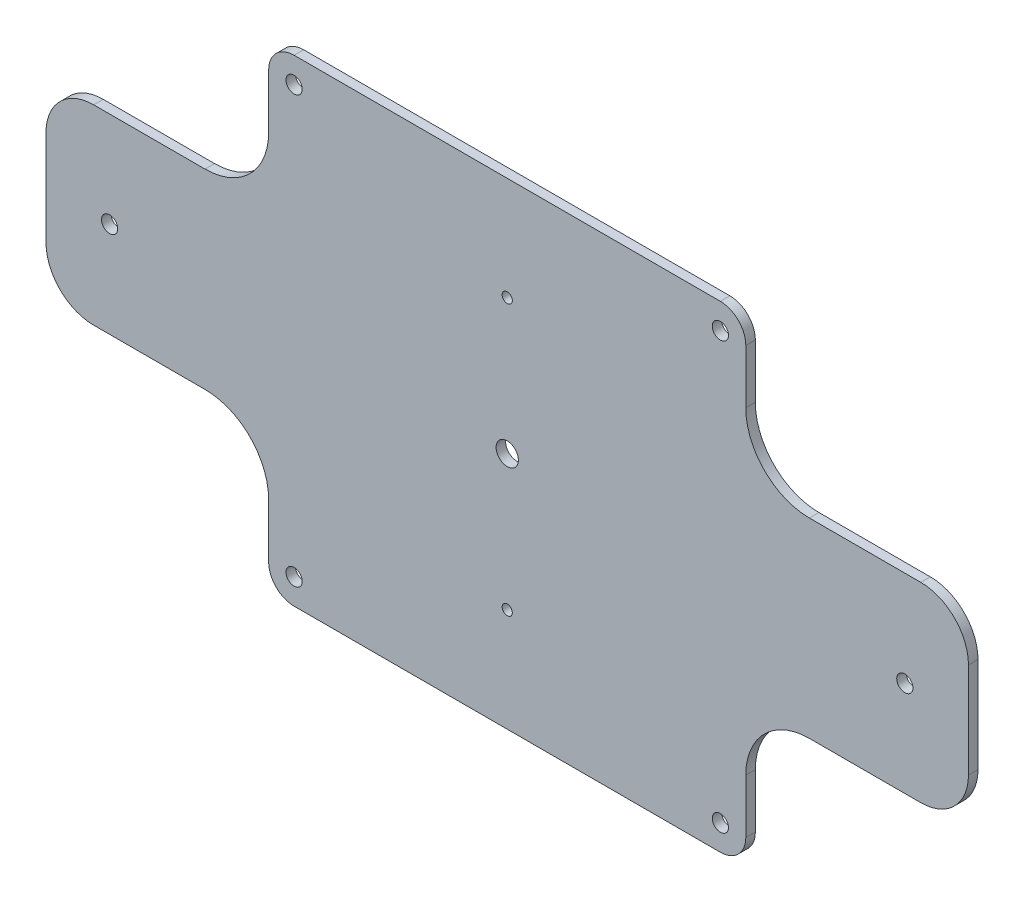
ISO-10303-21;
HEADER;
FILE_DESCRIPTION(('STEP AP214'),'2;1');
FILE_NAME('part.step','',(''),(''),'','','');
FILE_SCHEMA(('AUTOMOTIVE_DESIGN { 1 0 10303 214 1 1 1 1 }'));
ENDSEC;
DATA;
#1=APPLICATION_CONTEXT('core data for automotive mechanical design processes');
#2=APPLICATION_PROTOCOL_DEFINITION('international standard','automotive_design',2000,#1);
#3=PRODUCT_CONTEXT('',#1,'mechanical');
#4=PRODUCT('Part','Part','',(#3));
#5=PRODUCT_RELATED_PRODUCT_CATEGORY('part','',(#4));
#6=PRODUCT_DEFINITION_FORMATION('','',#4);
#7=PRODUCT_DEFINITION_CONTEXT('part definition',#1,'design');
#8=PRODUCT_DEFINITION('design','',#6,#7);
#9=PRODUCT_DEFINITION_SHAPE('','',#8);
#10=(LENGTH_UNIT() NAMED_UNIT(*) SI_UNIT(.MILLI.,.METRE.));
#11=(NAMED_UNIT(*) PLANE_ANGLE_UNIT() SI_UNIT($,.RADIAN.));
#12=(NAMED_UNIT(*) SI_UNIT($,.STERADIAN.) SOLID_ANGLE_UNIT());
#13=UNCERTAINTY_MEASURE_WITH_UNIT(LENGTH_MEASURE(1.E-05),#10,'distance_accuracy_value','');
#14=(GEOMETRIC_REPRESENTATION_CONTEXT(3) GLOBAL_UNCERTAINTY_ASSIGNED_CONTEXT((#13)) GLOBAL_UNIT_ASSIGNED_CONTEXT((#10,
#11,#12)) REPRESENTATION_CONTEXT('',''));
#15=CARTESIAN_POINT('',(0.,0.,0.));
#16=DIRECTION('',(0.,0.,1.));
#17=DIRECTION('',(1.,0.,0.));
#18=AXIS2_PLACEMENT_3D('',#15,#16,#17);
#19=CARTESIAN_POINT('',(75.,75.,3.));
#20=DIRECTION('',(-1.,0.,0.));
#21=DIRECTION('',(0.,0.,1.));
#22=AXIS2_PLACEMENT_3D('',#19,#20,#21);
#23=PLANE('',#22);
#24=DIRECTION('',(0.,1.,0.));
#25=VECTOR('',#24,1.);
#26=CARTESIAN_POINT('',(75.,75.,3.));
#27=LINE('',#26,#25);
#28=CARTESIAN_POINT('',(75.,50.,3.));
#29=VERTEX_POINT('',#28);
#30=CARTESIAN_POINT('',(75.,67.,3.));
#31=VERTEX_POINT('',#30);
#32=EDGE_CURVE('E228',#29,#31,#27,.T.);
#33=ORIENTED_EDGE('',*,*,#32,.F.);
#34=DIRECTION('',(0.,0.,1.));
#35=VECTOR('',#34,1.);
#36=CARTESIAN_POINT('',(75.,50.,0.));
#37=LINE('',#36,#35);
#38=CARTESIAN_POINT('',(75.,50.,0.));
#39=VERTEX_POINT('',#38);
#40=EDGE_CURVE('E286',#29,#39,#37,.F.);
#41=ORIENTED_EDGE('',*,*,#40,.T.);
#42=DIRECTION('',(0.,1.,0.));
#43=VECTOR('',#42,1.);
#44=CARTESIAN_POINT('',(75.,75.,0.));
#45=LINE('',#44,#43);
#46=CARTESIAN_POINT('',(75.,67.,0.));
#47=VERTEX_POINT('',#46);
#48=EDGE_CURVE('E254',#39,#47,#45,.T.);
#49=ORIENTED_EDGE('',*,*,#48,.T.);
#50=DIRECTION('',(0.,0.,-1.));
#51=VECTOR('',#50,1.);
#52=CARTESIAN_POINT('',(75.,67.,3.));
#53=LINE('',#52,#51);
#54=EDGE_CURVE('E272',#47,#31,#53,.F.);
#55=ORIENTED_EDGE('',*,*,#54,.T.);
#56=EDGE_LOOP('',(#33,#41,#49,#55));
#57=FACE_BOUND('',#56,.T.);
#58=ADVANCED_FACE('F35',(#57),#23,.F.);
#59=CARTESIAN_POINT('',(75.,-67.,0.));
#60=VERTEX_POINT('',#59);
#61=CARTESIAN_POINT('',(75.,-50.,0.));
#62=VERTEX_POINT('',#61);
#63=EDGE_CURVE('E430',#60,#62,#45,.T.);
#64=ORIENTED_EDGE('',*,*,#63,.T.);
#65=DIRECTION('',(0.,0.,1.));
#66=VECTOR('',#65,1.);
#67=CARTESIAN_POINT('',(75.,-50.,3.));
#68=LINE('',#67,#66);
#69=CARTESIAN_POINT('',(75.,-50.,3.));
#70=VERTEX_POINT('',#69);
#71=EDGE_CURVE('E288',#62,#70,#68,.T.);
#72=ORIENTED_EDGE('',*,*,#71,.T.);
#73=CARTESIAN_POINT('',(75.,-67.,3.));
#74=VERTEX_POINT('',#73);
#75=EDGE_CURVE('E231',#74,#70,#27,.T.);
#76=ORIENTED_EDGE('',*,*,#75,.F.);
#77=DIRECTION('',(0.,0.,-1.));
#78=VECTOR('',#77,1.);
#79=CARTESIAN_POINT('',(75.,-67.,3.));
#80=LINE('',#79,#78);
#81=EDGE_CURVE('E275',#74,#60,#80,.T.);
#82=ORIENTED_EDGE('',*,*,#81,.T.);
#83=EDGE_LOOP('',(#64,#72,#76,#82));
#84=FACE_BOUND('',#83,.T.);
#85=ADVANCED_FACE('F518',(#84),#23,.F.);
#86=CARTESIAN_POINT('',(-75.,75.,3.));
#87=DIRECTION('',(1.,0.,0.));
#88=DIRECTION('',(0.,0.,-1.));
#89=AXIS2_PLACEMENT_3D('',#86,#87,#88);
#90=PLANE('',#89);
#91=DIRECTION('',(0.,-1.,0.));
#92=VECTOR('',#91,1.);
#93=CARTESIAN_POINT('',(-75.,75.,0.));
#94=LINE('',#93,#92);
#95=CARTESIAN_POINT('',(-75.,67.,0.));
#96=VERTEX_POINT('',#95);
#97=CARTESIAN_POINT('',(-75.,50.,0.));
#98=VERTEX_POINT('',#97);
#99=EDGE_CURVE('E229',#96,#98,#94,.T.);
#100=ORIENTED_EDGE('',*,*,#99,.T.);
#101=DIRECTION('',(0.,0.,1.));
#102=VECTOR('',#101,1.);
#103=CARTESIAN_POINT('',(-75.,50.,3.));
#104=LINE('',#103,#102);
#105=CARTESIAN_POINT('',(-75.,50.,3.));
#106=VERTEX_POINT('',#105);
#107=EDGE_CURVE('E298',#98,#106,#104,.T.);
#108=ORIENTED_EDGE('',*,*,#107,.T.);
#109=DIRECTION('',(0.,-1.,0.));
#110=VECTOR('',#109,1.);
#111=CARTESIAN_POINT('',(-75.,75.,3.));
#112=LINE('',#111,#110);
#113=CARTESIAN_POINT('',(-75.,67.,3.));
#114=VERTEX_POINT('',#113);
#115=EDGE_CURVE('E426',#114,#106,#112,.T.);
#116=ORIENTED_EDGE('',*,*,#115,.F.);
#117=DIRECTION('',(0.,0.,-1.));
#118=VECTOR('',#117,1.);
#119=CARTESIAN_POINT('',(-75.,67.,3.));
#120=LINE('',#119,#118);
#121=EDGE_CURVE('E210',#114,#96,#120,.T.);
#122=ORIENTED_EDGE('',*,*,#121,.T.);
#123=EDGE_LOOP('',(#100,#108,#116,#122));
#124=FACE_BOUND('',#123,.T.);
#125=ADVANCED_FACE('F475',(#124),#90,.F.);
#126=CARTESIAN_POINT('',(-75.,75.,3.));
#127=DIRECTION('',(0.,-1.,0.));
#128=DIRECTION('',(0.,0.,-1.));
#129=AXIS2_PLACEMENT_3D('',#126,#127,#128);
#130=PLANE('',#129);
#131=DIRECTION('',(-1.,0.,0.));
#132=VECTOR('',#131,1.);
#133=CARTESIAN_POINT('',(-75.,75.,3.));
#134=LINE('',#133,#132);
#135=CARTESIAN_POINT('',(67.,75.,3.));
#136=VERTEX_POINT('',#135);
#137=CARTESIAN_POINT('',(-67.,75.,3.));
#138=VERTEX_POINT('',#137);
#139=EDGE_CURVE('E422',#136,#138,#134,.T.);
#140=ORIENTED_EDGE('',*,*,#139,.F.);
#141=DIRECTION('',(0.,0.,-1.));
#142=VECTOR('',#141,1.);
#143=CARTESIAN_POINT('',(67.,75.,3.));
#144=LINE('',#143,#142);
#145=CARTESIAN_POINT('',(67.,75.,0.));
#146=VERTEX_POINT('',#145);
#147=EDGE_CURVE('E280',#136,#146,#144,.T.);
#148=ORIENTED_EDGE('',*,*,#147,.T.);
#149=DIRECTION('',(-1.,0.,0.));
#150=VECTOR('',#149,1.);
#151=CARTESIAN_POINT('',(-75.,75.,0.));
#152=LINE('',#151,#150);
#153=CARTESIAN_POINT('',(-67.,75.,0.));
#154=VERTEX_POINT('',#153);
#155=EDGE_CURVE('E432',#146,#154,#152,.T.);
#156=ORIENTED_EDGE('',*,*,#155,.T.);
#157=DIRECTION('',(0.,0.,-1.));
#158=VECTOR('',#157,1.);
#159=CARTESIAN_POINT('',(-67.,75.,3.));
#160=LINE('',#159,#158);
#161=EDGE_CURVE('E278',#154,#138,#160,.F.);
#162=ORIENTED_EDGE('',*,*,#161,.T.);
#163=EDGE_LOOP('',(#140,#148,#156,#162));
#164=FACE_BOUND('',#163,.T.);
#165=ADVANCED_FACE('F538',(#164),#130,.F.);
#166=CARTESIAN_POINT('',(-75.,-50.,3.));
#167=VERTEX_POINT('',#166);
#168=CARTESIAN_POINT('',(-75.,-67.,3.));
#169=VERTEX_POINT('',#168);
#170=EDGE_CURVE('E425',#167,#169,#112,.T.);
#171=ORIENTED_EDGE('',*,*,#170,.F.);
#172=DIRECTION('',(0.,0.,1.));
#173=VECTOR('',#172,1.);
#174=CARTESIAN_POINT('',(-75.,-50.,3.));
#175=LINE('',#174,#173);
#176=CARTESIAN_POINT('',(-75.,-50.,0.));
#177=VERTEX_POINT('',#176);
#178=EDGE_CURVE('E296',#167,#177,#175,.F.);
#179=ORIENTED_EDGE('',*,*,#178,.T.);
#180=CARTESIAN_POINT('',(-75.,-67.,0.));
#181=VERTEX_POINT('',#180);
#182=EDGE_CURVE('E234',#177,#181,#94,.T.);
#183=ORIENTED_EDGE('',*,*,#182,.T.);
#184=DIRECTION('',(0.,0.,-1.));
#185=VECTOR('',#184,1.);
#186=CARTESIAN_POINT('',(-75.,-67.,3.));
#187=LINE('',#186,#185);
#188=EDGE_CURVE('E207',#181,#169,#187,.F.);
#189=ORIENTED_EDGE('',*,*,#188,.T.);
#190=EDGE_LOOP('',(#171,#179,#183,#189));
#191=FACE_BOUND('',#190,.T.);
#192=ADVANCED_FACE('F439',(#191),#90,.F.);
#193=CARTESIAN_POINT('',(-75.,-75.,3.));
#194=DIRECTION('',(0.,1.,0.));
#195=DIRECTION('',(0.,0.,1.));
#196=AXIS2_PLACEMENT_3D('',#193,#194,#195);
#197=PLANE('',#196);
#198=DIRECTION('',(1.,0.,0.));
#199=VECTOR('',#198,1.);
#200=CARTESIAN_POINT('',(-75.,-75.,3.));
#201=LINE('',#200,#199);
#202=CARTESIAN_POINT('',(-67.,-75.,3.));
#203=VERTEX_POINT('',#202);
#204=CARTESIAN_POINT('',(67.,-75.,3.));
#205=VERTEX_POINT('',#204);
#206=EDGE_CURVE('E220',#203,#205,#201,.T.);
#207=ORIENTED_EDGE('',*,*,#206,.F.);
#208=DIRECTION('',(0.,0.,-1.));
#209=VECTOR('',#208,1.);
#210=CARTESIAN_POINT('',(-67.,-75.,3.));
#211=LINE('',#210,#209);
#212=CARTESIAN_POINT('',(-67.,-75.,0.));
#213=VERTEX_POINT('',#212);
#214=EDGE_CURVE('E205',#203,#213,#211,.T.);
#215=ORIENTED_EDGE('',*,*,#214,.T.);
#216=DIRECTION('',(1.,0.,0.));
#217=VECTOR('',#216,1.);
#218=CARTESIAN_POINT('',(-75.,-75.,0.));
#219=LINE('',#218,#217);
#220=CARTESIAN_POINT('',(67.,-75.,0.));
#221=VERTEX_POINT('',#220);
#222=EDGE_CURVE('E217',#213,#221,#219,.T.);
#223=ORIENTED_EDGE('',*,*,#222,.T.);
#224=DIRECTION('',(0.,0.,-1.));
#225=VECTOR('',#224,1.);
#226=CARTESIAN_POINT('',(67.,-75.,3.));
#227=LINE('',#226,#225);
#228=EDGE_CURVE('E222',#221,#205,#227,.F.);
#229=ORIENTED_EDGE('',*,*,#228,.T.);
#230=EDGE_LOOP('',(#207,#215,#223,#229));
#231=FACE_BOUND('',#230,.T.);
#232=ADVANCED_FACE('F216',(#231),#197,.F.);
#233=CARTESIAN_POINT('',(0.,0.,3.));
#234=DIRECTION('',(0.,0.,1.));
#235=DIRECTION('',(1.,0.,0.));
#236=AXIS2_PLACEMENT_3D('',#233,#234,#235);
#237=PLANE('',#236);
#238=CARTESIAN_POINT('',(0.,42.5,3.));
#239=DIRECTION('',(0.,0.,1.));
#240=DIRECTION('',(1.,0.,0.));
#241=AXIS2_PLACEMENT_3D('',#238,#239,#240);
#242=CIRCLE('',#241,1.6);
#243=CARTESIAN_POINT('',(1.6,42.5,3.));
#244=VERTEX_POINT('',#243);
#245=EDGE_CURVE('E353',#244,#244,#242,.T.);
#246=ORIENTED_EDGE('',*,*,#245,.F.);
#247=EDGE_LOOP('',(#246));
#248=FACE_BOUND('',#247,.T.);
#249=CARTESIAN_POINT('',(0.,-42.5,3.));
#250=DIRECTION('',(0.,0.,1.));
#251=DIRECTION('',(1.,0.,0.));
#252=AXIS2_PLACEMENT_3D('',#249,#250,#251);
#253=CIRCLE('',#252,1.6);
#254=CARTESIAN_POINT('',(1.60000000000001,-42.5,3.));
#255=VERTEX_POINT('',#254);
#256=EDGE_CURVE('E359',#255,#255,#253,.T.);
#257=ORIENTED_EDGE('',*,*,#256,.F.);
#258=EDGE_LOOP('',(#257));
#259=FACE_BOUND('',#258,.T.);
#260=CARTESIAN_POINT('',(0.,0.,3.));
#261=DIRECTION('',(0.,0.,1.));
#262=DIRECTION('',(1.,0.,0.));
#263=AXIS2_PLACEMENT_3D('',#260,#261,#262);
#264=CIRCLE('',#263,3.5);
#265=CARTESIAN_POINT('',(3.5,0.,3.));
#266=VERTEX_POINT('',#265);
#267=EDGE_CURVE('E407',#266,#266,#264,.T.);
#268=ORIENTED_EDGE('',*,*,#267,.F.);
#269=EDGE_LOOP('',(#268));
#270=FACE_BOUND('',#269,.T.);
#271=CARTESIAN_POINT('',(67.,67.,3.));
#272=DIRECTION('',(0.,0.,1.));
#273=DIRECTION('',(1.,0.,0.));
#274=AXIS2_PLACEMENT_3D('',#271,#272,#273);
#275=CIRCLE('',#274,2.54999999999999);
#276=CARTESIAN_POINT('',(69.55,67.,3.));
#277=VERTEX_POINT('',#276);
#278=EDGE_CURVE('E414',#277,#277,#275,.T.);
#279=ORIENTED_EDGE('',*,*,#278,.F.);
#280=EDGE_LOOP('',(#279));
#281=FACE_BOUND('',#280,.T.);
#282=CARTESIAN_POINT('',(67.,-67.,3.));
#283=DIRECTION('',(0.,0.,1.));
#284=DIRECTION('',(1.,0.,0.));
#285=AXIS2_PLACEMENT_3D('',#282,#283,#284);
#286=CIRCLE('',#285,2.54999999999999);
#287=CARTESIAN_POINT('',(69.55,-67.,3.));
#288=VERTEX_POINT('',#287);
#289=EDGE_CURVE('E411',#288,#288,#286,.T.);
#290=ORIENTED_EDGE('',*,*,#289,.F.);
#291=EDGE_LOOP('',(#290));
#292=FACE_BOUND('',#291,.T.);
#293=CARTESIAN_POINT('',(-67.,-67.,3.));
#294=DIRECTION('',(0.,0.,1.));
#295=DIRECTION('',(1.,0.,0.));
#296=AXIS2_PLACEMENT_3D('',#293,#294,#295);
#297=CIRCLE('',#296,2.54999999999999);
#298=CARTESIAN_POINT('',(-64.45,-67.,3.));
#299=VERTEX_POINT('',#298);
#300=EDGE_CURVE('E408',#299,#299,#297,.T.);
#301=ORIENTED_EDGE('',*,*,#300,.F.);
#302=EDGE_LOOP('',(#301));
#303=FACE_BOUND('',#302,.T.);
#304=CARTESIAN_POINT('',(-67.,67.,3.));
#305=DIRECTION('',(0.,0.,1.));
#306=DIRECTION('',(1.,0.,0.));
#307=AXIS2_PLACEMENT_3D('',#304,#305,#306);
#308=CIRCLE('',#307,2.54999999999999);
#309=CARTESIAN_POINT('',(-64.45,67.,3.));
#310=VERTEX_POINT('',#309);
#311=EDGE_CURVE('E242',#310,#310,#308,.T.);
#312=ORIENTED_EDGE('',*,*,#311,.F.);
#313=EDGE_LOOP('',(#312));
#314=FACE_BOUND('',#313,.T.);
#315=DIRECTION('',(-1.,0.,0.));
#316=VECTOR('',#315,1.);
#317=CARTESIAN_POINT('',(145.,-30.,3.));
#318=LINE('',#317,#316);
#319=CARTESIAN_POINT('',(130.,-30.,3.));
#320=VERTEX_POINT('',#319);
#321=CARTESIAN_POINT('',(95.,-30.,3.));
#322=VERTEX_POINT('',#321);
#323=EDGE_CURVE('E374',#320,#322,#318,.T.);
#324=ORIENTED_EDGE('',*,*,#323,.F.);
#325=CARTESIAN_POINT('',(130.,-15.,3.));
#326=DIRECTION('',(0.,0.,1.));
#327=DIRECTION('',(1.,0.,0.));
#328=AXIS2_PLACEMENT_3D('',#325,#326,#327);
#329=CIRCLE('',#328,15.);
#330=CARTESIAN_POINT('',(145.,-15.,3.));
#331=VERTEX_POINT('',#330);
#332=EDGE_CURVE('E331',#320,#331,#329,.T.);
#333=ORIENTED_EDGE('',*,*,#332,.T.);
#334=DIRECTION('',(0.,-1.,0.));
#335=VECTOR('',#334,1.);
#336=CARTESIAN_POINT('',(145.,-30.,3.));
#337=LINE('',#336,#335);
#338=CARTESIAN_POINT('',(145.,15.,3.));
#339=VERTEX_POINT('',#338);
#340=EDGE_CURVE('E370',#339,#331,#337,.T.);
#341=ORIENTED_EDGE('',*,*,#340,.F.);
#342=CARTESIAN_POINT('',(130.,15.,3.));
#343=DIRECTION('',(0.,0.,1.));
#344=DIRECTION('',(1.,0.,0.));
#345=AXIS2_PLACEMENT_3D('',#342,#343,#344);
#346=CIRCLE('',#345,15.);
#347=CARTESIAN_POINT('',(130.,30.,3.));
#348=VERTEX_POINT('',#347);
#349=EDGE_CURVE('E329',#339,#348,#346,.T.);
#350=ORIENTED_EDGE('',*,*,#349,.T.);
#351=DIRECTION('',(1.,0.,0.));
#352=VECTOR('',#351,1.);
#353=CARTESIAN_POINT('',(145.,30.,3.));
#354=LINE('',#353,#352);
#355=CARTESIAN_POINT('',(95.,30.,3.));
#356=VERTEX_POINT('',#355);
#357=EDGE_CURVE('E366',#356,#348,#354,.T.);
#358=ORIENTED_EDGE('',*,*,#357,.F.);
#359=CARTESIAN_POINT('',(95.,50.,3.));
#360=DIRECTION('',(0.,0.,1.));
#361=DIRECTION('',(1.,0.,0.));
#362=AXIS2_PLACEMENT_3D('',#359,#360,#361);
#363=CIRCLE('',#362,20.);
#364=EDGE_CURVE('E304',#356,#29,#363,.F.);
#365=ORIENTED_EDGE('',*,*,#364,.T.);
#366=ORIENTED_EDGE('',*,*,#32,.T.);
#367=CARTESIAN_POINT('',(67.,67.,3.));
#368=DIRECTION('',(0.,0.,1.));
#369=DIRECTION('',(1.,0.,0.));
#370=AXIS2_PLACEMENT_3D('',#367,#368,#369);
#371=CIRCLE('',#370,8.);
#372=EDGE_CURVE('E266',#31,#136,#371,.T.);
#373=ORIENTED_EDGE('',*,*,#372,.T.);
#374=ORIENTED_EDGE('',*,*,#139,.T.);
#375=CARTESIAN_POINT('',(-67.,67.,3.));
#376=DIRECTION('',(0.,0.,1.));
#377=DIRECTION('',(1.,0.,0.));
#378=AXIS2_PLACEMENT_3D('',#375,#376,#377);
#379=CIRCLE('',#378,8.);
#380=EDGE_CURVE('E264',#138,#114,#379,.T.);
#381=ORIENTED_EDGE('',*,*,#380,.T.);
#382=ORIENTED_EDGE('',*,*,#115,.T.);
#383=CARTESIAN_POINT('',(-95.,50.,3.));
#384=DIRECTION('',(0.,0.,1.));
#385=DIRECTION('',(1.,0.,0.));
#386=AXIS2_PLACEMENT_3D('',#383,#384,#385);
#387=CIRCLE('',#386,20.);
#388=CARTESIAN_POINT('',(-95.,30.,3.));
#389=VERTEX_POINT('',#388);
#390=EDGE_CURVE('E318',#106,#389,#387,.F.);
#391=ORIENTED_EDGE('',*,*,#390,.T.);
#392=DIRECTION('',(-1.,0.,0.));
#393=VECTOR('',#392,1.);
#394=CARTESIAN_POINT('',(-145.,30.,3.));
#395=LINE('',#394,#393);
#396=CARTESIAN_POINT('',(-130.,30.,3.));
#397=VERTEX_POINT('',#396);
#398=EDGE_CURVE('E398',#389,#397,#395,.T.);
#399=ORIENTED_EDGE('',*,*,#398,.T.);
#400=CARTESIAN_POINT('',(-130.,15.,3.));
#401=DIRECTION('',(0.,0.,1.));
#402=DIRECTION('',(1.,0.,0.));
#403=AXIS2_PLACEMENT_3D('',#400,#401,#402);
#404=CIRCLE('',#403,15.);
#405=CARTESIAN_POINT('',(-145.,15.,3.));
#406=VERTEX_POINT('',#405);
#407=EDGE_CURVE('E325',#397,#406,#404,.T.);
#408=ORIENTED_EDGE('',*,*,#407,.T.);
#409=DIRECTION('',(0.,-1.,0.));
#410=VECTOR('',#409,1.);
#411=CARTESIAN_POINT('',(-145.,-30.,3.));
#412=LINE('',#411,#410);
#413=CARTESIAN_POINT('',(-145.,-15.,3.));
#414=VERTEX_POINT('',#413);
#415=EDGE_CURVE('E401',#406,#414,#412,.T.);
#416=ORIENTED_EDGE('',*,*,#415,.T.);
#417=CARTESIAN_POINT('',(-130.,-15.,3.));
#418=DIRECTION('',(0.,0.,1.));
#419=DIRECTION('',(1.,0.,0.));
#420=AXIS2_PLACEMENT_3D('',#417,#418,#419);
#421=CIRCLE('',#420,15.);
#422=CARTESIAN_POINT('',(-130.,-30.,3.));
#423=VERTEX_POINT('',#422);
#424=EDGE_CURVE('E327',#414,#423,#421,.T.);
#425=ORIENTED_EDGE('',*,*,#424,.T.);
#426=DIRECTION('',(1.,0.,0.));
#427=VECTOR('',#426,1.);
#428=CARTESIAN_POINT('',(-145.,-30.,3.));
#429=LINE('',#428,#427);
#430=CARTESIAN_POINT('',(-95.,-30.,3.));
#431=VERTEX_POINT('',#430);
#432=EDGE_CURVE('E393',#423,#431,#429,.T.);
#433=ORIENTED_EDGE('',*,*,#432,.T.);
#434=CARTESIAN_POINT('',(-95.,-50.,3.));
#435=DIRECTION('',(0.,0.,1.));
#436=DIRECTION('',(1.,0.,0.));
#437=AXIS2_PLACEMENT_3D('',#434,#435,#436);
#438=CIRCLE('',#437,20.);
#439=EDGE_CURVE('E314',#431,#167,#438,.F.);
#440=ORIENTED_EDGE('',*,*,#439,.T.);
#441=ORIENTED_EDGE('',*,*,#170,.T.);
#442=CARTESIAN_POINT('',(-67.,-67.,3.));
#443=DIRECTION('',(0.,0.,1.));
#444=DIRECTION('',(1.,0.,0.));
#445=AXIS2_PLACEMENT_3D('',#442,#443,#444);
#446=CIRCLE('',#445,8.);
#447=EDGE_CURVE('E270',#169,#203,#446,.T.);
#448=ORIENTED_EDGE('',*,*,#447,.T.);
#449=ORIENTED_EDGE('',*,*,#206,.T.);
#450=CARTESIAN_POINT('',(67.,-67.,3.));
#451=DIRECTION('',(0.,0.,1.));
#452=DIRECTION('',(1.,0.,0.));
#453=AXIS2_PLACEMENT_3D('',#450,#451,#452);
#454=CIRCLE('',#453,8.);
#455=EDGE_CURVE('E268',#205,#74,#454,.T.);
#456=ORIENTED_EDGE('',*,*,#455,.T.);
#457=ORIENTED_EDGE('',*,*,#75,.T.);
#458=CARTESIAN_POINT('',(95.,-50.,3.));
#459=DIRECTION('',(0.,0.,1.));
#460=DIRECTION('',(1.,0.,0.));
#461=AXIS2_PLACEMENT_3D('',#458,#459,#460);
#462=CIRCLE('',#461,20.);
#463=EDGE_CURVE('E309',#70,#322,#462,.F.);
#464=ORIENTED_EDGE('',*,*,#463,.T.);
#465=EDGE_LOOP('',(#324,#333,#341,#350,#358,#365,#366,#373,#374,#381,#382,#391,#399,#408,#416,
#425,#433,#440,#441,#448,#449,#456,#457,#464));
#466=FACE_BOUND('',#465,.T.);
#467=CARTESIAN_POINT('',(-125.,0.,3.));
#468=DIRECTION('',(0.,0.,1.));
#469=DIRECTION('',(1.,0.,0.));
#470=AXIS2_PLACEMENT_3D('',#467,#468,#469);
#471=CIRCLE('',#470,2.54999999999999);
#472=CARTESIAN_POINT('',(-122.45,0.,3.));
#473=VERTEX_POINT('',#472);
#474=EDGE_CURVE('E386',#473,#473,#471,.T.);
#475=ORIENTED_EDGE('',*,*,#474,.F.);
#476=EDGE_LOOP('',(#475));
#477=FACE_BOUND('',#476,.T.);
#478=CARTESIAN_POINT('',(125.,0.,3.));
#479=DIRECTION('',(0.,0.,-1.));
#480=DIRECTION('',(-1.,0.,0.));
#481=AXIS2_PLACEMENT_3D('',#478,#479,#480);
#482=CIRCLE('',#481,2.54999999999999);
#483=CARTESIAN_POINT('',(122.45,0.,3.));
#484=VERTEX_POINT('',#483);
#485=EDGE_CURVE('E357',#484,#484,#482,.T.);
#486=ORIENTED_EDGE('',*,*,#485,.T.);
#487=EDGE_LOOP('',(#486));
#488=FACE_BOUND('',#487,.T.);
#489=ADVANCED_FACE('F462',(#248,#259,#270,#281,#292,#303,#314,#466,#477,#488),#237,.T.);
#490=CARTESIAN_POINT('',(0.,0.,0.));
#491=DIRECTION('',(0.,0.,1.));
#492=DIRECTION('',(1.,0.,0.));
#493=AXIS2_PLACEMENT_3D('',#490,#491,#492);
#494=PLANE('',#493);
#495=CARTESIAN_POINT('',(0.,42.5,0.));
#496=DIRECTION('',(0.,0.,1.));
#497=DIRECTION('',(1.,0.,0.));
#498=AXIS2_PLACEMENT_3D('',#495,#496,#497);
#499=CIRCLE('',#498,1.6);
#500=CARTESIAN_POINT('',(1.6,42.5,0.));
#501=VERTEX_POINT('',#500);
#502=EDGE_CURVE('E39',#501,#501,#499,.T.);
#503=ORIENTED_EDGE('',*,*,#502,.T.);
#504=EDGE_LOOP('',(#503));
#505=FACE_BOUND('',#504,.T.);
#506=CARTESIAN_POINT('',(0.,-42.5,0.));
#507=DIRECTION('',(0.,0.,1.));
#508=DIRECTION('',(1.,0.,0.));
#509=AXIS2_PLACEMENT_3D('',#506,#507,#508);
#510=CIRCLE('',#509,1.6);
#511=CARTESIAN_POINT('',(1.60000000000001,-42.5,0.));
#512=VERTEX_POINT('',#511);
#513=EDGE_CURVE('E351',#512,#512,#510,.T.);
#514=ORIENTED_EDGE('',*,*,#513,.T.);
#515=EDGE_LOOP('',(#514));
#516=FACE_BOUND('',#515,.T.);
#517=CARTESIAN_POINT('',(0.,0.,0.));
#518=DIRECTION('',(0.,0.,1.));
#519=DIRECTION('',(1.,0.,0.));
#520=AXIS2_PLACEMENT_3D('',#517,#518,#519);
#521=CIRCLE('',#520,3.5);
#522=CARTESIAN_POINT('',(3.5,0.,0.));
#523=VERTEX_POINT('',#522);
#524=EDGE_CURVE('E251',#523,#523,#521,.T.);
#525=ORIENTED_EDGE('',*,*,#524,.T.);
#526=EDGE_LOOP('',(#525));
#527=FACE_BOUND('',#526,.T.);
#528=CARTESIAN_POINT('',(67.,67.,0.));
#529=DIRECTION('',(0.,0.,1.));
#530=DIRECTION('',(1.,0.,0.));
#531=AXIS2_PLACEMENT_3D('',#528,#529,#530);
#532=CIRCLE('',#531,2.54999999999999);
#533=CARTESIAN_POINT('',(69.55,67.,0.));
#534=VERTEX_POINT('',#533);
#535=EDGE_CURVE('E248',#534,#534,#532,.T.);
#536=ORIENTED_EDGE('',*,*,#535,.T.);
#537=EDGE_LOOP('',(#536));
#538=FACE_BOUND('',#537,.T.);
#539=CARTESIAN_POINT('',(67.,-67.,0.));
#540=DIRECTION('',(0.,0.,1.));
#541=DIRECTION('',(1.,0.,0.));
#542=AXIS2_PLACEMENT_3D('',#539,#540,#541);
#543=CIRCLE('',#542,2.54999999999999);
#544=CARTESIAN_POINT('',(69.55,-67.,0.));
#545=VERTEX_POINT('',#544);
#546=EDGE_CURVE('E245',#545,#545,#543,.T.);
#547=ORIENTED_EDGE('',*,*,#546,.T.);
#548=EDGE_LOOP('',(#547));
#549=FACE_BOUND('',#548,.T.);
#550=CARTESIAN_POINT('',(-67.,-67.,0.));
#551=DIRECTION('',(0.,0.,1.));
#552=DIRECTION('',(1.,0.,0.));
#553=AXIS2_PLACEMENT_3D('',#550,#551,#552);
#554=CIRCLE('',#553,2.54999999999999);
#555=CARTESIAN_POINT('',(-64.45,-67.,0.));
#556=VERTEX_POINT('',#555);
#557=EDGE_CURVE('E241',#556,#556,#554,.T.);
#558=ORIENTED_EDGE('',*,*,#557,.T.);
#559=EDGE_LOOP('',(#558));
#560=FACE_BOUND('',#559,.T.);
#561=CARTESIAN_POINT('',(-67.,67.,0.));
#562=DIRECTION('',(0.,0.,1.));
#563=DIRECTION('',(1.,0.,0.));
#564=AXIS2_PLACEMENT_3D('',#561,#562,#563);
#565=CIRCLE('',#564,2.54999999999999);
#566=CARTESIAN_POINT('',(-64.45,67.,0.));
#567=VERTEX_POINT('',#566);
#568=EDGE_CURVE('E238',#567,#567,#565,.T.);
#569=ORIENTED_EDGE('',*,*,#568,.T.);
#570=EDGE_LOOP('',(#569));
#571=FACE_BOUND('',#570,.T.);
#572=DIRECTION('',(0.,1.,0.));
#573=VECTOR('',#572,1.);
#574=CARTESIAN_POINT('',(145.,-30.,0.));
#575=LINE('',#574,#573);
#576=CARTESIAN_POINT('',(145.,-15.,0.));
#577=VERTEX_POINT('',#576);
#578=CARTESIAN_POINT('',(145.,15.,0.));
#579=VERTEX_POINT('',#578);
#580=EDGE_CURVE('E368',#577,#579,#575,.T.);
#581=ORIENTED_EDGE('',*,*,#580,.F.);
#582=CARTESIAN_POINT('',(130.,-15.,0.));
#583=DIRECTION('',(0.,0.,1.));
#584=DIRECTION('',(1.,0.,0.));
#585=AXIS2_PLACEMENT_3D('',#582,#583,#584);
#586=CIRCLE('',#585,15.);
#587=CARTESIAN_POINT('',(130.,-30.,0.));
#588=VERTEX_POINT('',#587);
#589=EDGE_CURVE('E343',#577,#588,#586,.F.);
#590=ORIENTED_EDGE('',*,*,#589,.T.);
#591=DIRECTION('',(1.,0.,0.));
#592=VECTOR('',#591,1.);
#593=CARTESIAN_POINT('',(145.,-30.,0.));
#594=LINE('',#593,#592);
#595=CARTESIAN_POINT('',(95.,-30.,0.));
#596=VERTEX_POINT('',#595);
#597=EDGE_CURVE('E373',#596,#588,#594,.T.);
#598=ORIENTED_EDGE('',*,*,#597,.F.);
#599=CARTESIAN_POINT('',(95.,-50.,0.));
#600=DIRECTION('',(0.,0.,1.));
#601=DIRECTION('',(1.,0.,0.));
#602=AXIS2_PLACEMENT_3D('',#599,#600,#601);
#603=CIRCLE('',#602,20.);
#604=EDGE_CURVE('E312',#596,#62,#603,.T.);
#605=ORIENTED_EDGE('',*,*,#604,.T.);
#606=ORIENTED_EDGE('',*,*,#63,.F.);
#607=CARTESIAN_POINT('',(67.,-67.,0.));
#608=DIRECTION('',(0.,0.,1.));
#609=DIRECTION('',(1.,0.,0.));
#610=AXIS2_PLACEMENT_3D('',#607,#608,#609);
#611=CIRCLE('',#610,8.);
#612=EDGE_CURVE('E211',#60,#221,#611,.F.);
#613=ORIENTED_EDGE('',*,*,#612,.T.);
#614=ORIENTED_EDGE('',*,*,#222,.F.);
#615=CARTESIAN_POINT('',(-67.,-67.,0.));
#616=DIRECTION('',(0.,0.,1.));
#617=DIRECTION('',(1.,0.,0.));
#618=AXIS2_PLACEMENT_3D('',#615,#616,#617);
#619=CIRCLE('',#618,8.);
#620=EDGE_CURVE('E201',#213,#181,#619,.F.);
#621=ORIENTED_EDGE('',*,*,#620,.T.);
#622=ORIENTED_EDGE('',*,*,#182,.F.);
#623=CARTESIAN_POINT('',(-95.,-50.,0.));
#624=DIRECTION('',(0.,0.,1.));
#625=DIRECTION('',(1.,0.,0.));
#626=AXIS2_PLACEMENT_3D('',#623,#624,#625);
#627=CIRCLE('',#626,20.);
#628=CARTESIAN_POINT('',(-95.,-30.,0.));
#629=VERTEX_POINT('',#628);
#630=EDGE_CURVE('E316',#177,#629,#627,.T.);
#631=ORIENTED_EDGE('',*,*,#630,.T.);
#632=DIRECTION('',(-1.,0.,0.));
#633=VECTOR('',#632,1.);
#634=CARTESIAN_POINT('',(-145.,-30.,0.));
#635=LINE('',#634,#633);
#636=CARTESIAN_POINT('',(-130.,-30.,0.));
#637=VERTEX_POINT('',#636);
#638=EDGE_CURVE('E390',#629,#637,#635,.T.);
#639=ORIENTED_EDGE('',*,*,#638,.T.);
#640=CARTESIAN_POINT('',(-130.,-15.,0.));
#641=DIRECTION('',(0.,0.,1.));
#642=DIRECTION('',(1.,0.,0.));
#643=AXIS2_PLACEMENT_3D('',#640,#641,#642);
#644=CIRCLE('',#643,15.);
#645=CARTESIAN_POINT('',(-145.,-15.,0.));
#646=VERTEX_POINT('',#645);
#647=EDGE_CURVE('E339',#637,#646,#644,.F.);
#648=ORIENTED_EDGE('',*,*,#647,.T.);
#649=DIRECTION('',(0.,1.,0.));
#650=VECTOR('',#649,1.);
#651=CARTESIAN_POINT('',(-145.,-30.,0.));
#652=LINE('',#651,#650);
#653=CARTESIAN_POINT('',(-145.,15.,0.));
#654=VERTEX_POINT('',#653);
#655=EDGE_CURVE('E391',#646,#654,#652,.T.);
#656=ORIENTED_EDGE('',*,*,#655,.T.);
#657=CARTESIAN_POINT('',(-130.,15.,0.));
#658=DIRECTION('',(0.,0.,1.));
#659=DIRECTION('',(1.,0.,0.));
#660=AXIS2_PLACEMENT_3D('',#657,#658,#659);
#661=CIRCLE('',#660,15.);
#662=CARTESIAN_POINT('',(-130.,30.,0.));
#663=VERTEX_POINT('',#662);
#664=EDGE_CURVE('E60',#654,#663,#661,.F.);
#665=ORIENTED_EDGE('',*,*,#664,.T.);
#666=DIRECTION('',(1.,0.,0.));
#667=VECTOR('',#666,1.);
#668=CARTESIAN_POINT('',(-145.,30.,0.));
#669=LINE('',#668,#667);
#670=CARTESIAN_POINT('',(-95.,30.,0.));
#671=VERTEX_POINT('',#670);
#672=EDGE_CURVE('E387',#663,#671,#669,.T.);
#673=ORIENTED_EDGE('',*,*,#672,.T.);
#674=CARTESIAN_POINT('',(-95.,50.,0.));
#675=DIRECTION('',(0.,0.,1.));
#676=DIRECTION('',(1.,0.,0.));
#677=AXIS2_PLACEMENT_3D('',#674,#675,#676);
#678=CIRCLE('',#677,20.);
#679=EDGE_CURVE('E320',#671,#98,#678,.T.);
#680=ORIENTED_EDGE('',*,*,#679,.T.);
#681=ORIENTED_EDGE('',*,*,#99,.F.);
#682=CARTESIAN_POINT('',(-67.,67.,0.));
#683=DIRECTION('',(0.,0.,1.));
#684=DIRECTION('',(1.,0.,0.));
#685=AXIS2_PLACEMENT_3D('',#682,#683,#684);
#686=CIRCLE('',#685,8.);
#687=EDGE_CURVE('E221',#96,#154,#686,.F.);
#688=ORIENTED_EDGE('',*,*,#687,.T.);
#689=ORIENTED_EDGE('',*,*,#155,.F.);
#690=CARTESIAN_POINT('',(67.,67.,0.));
#691=DIRECTION('',(0.,0.,1.));
#692=DIRECTION('',(1.,0.,0.));
#693=AXIS2_PLACEMENT_3D('',#690,#691,#692);
#694=CIRCLE('',#693,8.);
#695=EDGE_CURVE('E257',#146,#47,#694,.F.);
#696=ORIENTED_EDGE('',*,*,#695,.T.);
#697=ORIENTED_EDGE('',*,*,#48,.F.);
#698=CARTESIAN_POINT('',(95.,50.,0.));
#699=DIRECTION('',(0.,0.,1.));
#700=DIRECTION('',(1.,0.,0.));
#701=AXIS2_PLACEMENT_3D('',#698,#699,#700);
#702=CIRCLE('',#701,20.);
#703=CARTESIAN_POINT('',(95.,30.,0.));
#704=VERTEX_POINT('',#703);
#705=EDGE_CURVE('E306',#39,#704,#702,.T.);
#706=ORIENTED_EDGE('',*,*,#705,.T.);
#707=DIRECTION('',(-1.,0.,0.));
#708=VECTOR('',#707,1.);
#709=CARTESIAN_POINT('',(145.,30.,0.));
#710=LINE('',#709,#708);
#711=CARTESIAN_POINT('',(130.,30.,0.));
#712=VERTEX_POINT('',#711);
#713=EDGE_CURVE('E369',#712,#704,#710,.T.);
#714=ORIENTED_EDGE('',*,*,#713,.F.);
#715=CARTESIAN_POINT('',(130.,15.,0.));
#716=DIRECTION('',(0.,0.,1.));
#717=DIRECTION('',(1.,0.,0.));
#718=AXIS2_PLACEMENT_3D('',#715,#716,#717);
#719=CIRCLE('',#718,15.);
#720=EDGE_CURVE('E341',#712,#579,#719,.F.);
#721=ORIENTED_EDGE('',*,*,#720,.T.);
#722=EDGE_LOOP('',(#581,#590,#598,#605,#606,#613,#614,#621,#622,#631,#639,#648,#656,#665,#673,
#680,#681,#688,#689,#696,#697,#706,#714,#721));
#723=FACE_BOUND('',#722,.T.);
#724=CARTESIAN_POINT('',(-125.,0.,0.));
#725=DIRECTION('',(0.,0.,1.));
#726=DIRECTION('',(1.,0.,0.));
#727=AXIS2_PLACEMENT_3D('',#724,#725,#726);
#728=CIRCLE('',#727,2.54999999999999);
#729=CARTESIAN_POINT('',(-122.45,0.,0.));
#730=VERTEX_POINT('',#729);
#731=EDGE_CURVE('E389',#730,#730,#728,.F.);
#732=ORIENTED_EDGE('',*,*,#731,.F.);
#733=EDGE_LOOP('',(#732));
#734=FACE_BOUND('',#733,.T.);
#735=CARTESIAN_POINT('',(125.,0.,0.));
#736=DIRECTION('',(0.,0.,1.));
#737=DIRECTION('',(1.,0.,0.));
#738=AXIS2_PLACEMENT_3D('',#735,#736,#737);
#739=CIRCLE('',#738,2.54999999999999);
#740=CARTESIAN_POINT('',(127.55,0.,0.));
#741=VERTEX_POINT('',#740);
#742=EDGE_CURVE('E376',#741,#741,#739,.T.);
#743=ORIENTED_EDGE('',*,*,#742,.T.);
#744=EDGE_LOOP('',(#743));
#745=FACE_BOUND('',#744,.T.);
#746=ADVANCED_FACE('F225',(#505,#516,#527,#538,#549,#560,#571,#723,#734,#745),#494,.F.);
#747=CARTESIAN_POINT('',(-67.,67.,-4.));
#748=DIRECTION('',(0.,0.,1.));
#749=DIRECTION('',(1.,0.,0.));
#750=AXIS2_PLACEMENT_3D('',#747,#748,#749);
#751=CYLINDRICAL_SURFACE('',#750,2.54999999999999);
#752=ORIENTED_EDGE('',*,*,#311,.T.);
#753=EDGE_LOOP('',(#752));
#754=FACE_BOUND('',#753,.T.);
#755=ORIENTED_EDGE('',*,*,#568,.F.);
#756=EDGE_LOOP('',(#755));
#757=FACE_BOUND('',#756,.T.);
#758=ADVANCED_FACE('F547',(#754,#757),#751,.F.);
#759=CARTESIAN_POINT('',(-67.,-67.,-4.));
#760=DIRECTION('',(0.,0.,1.));
#761=DIRECTION('',(1.,0.,0.));
#762=AXIS2_PLACEMENT_3D('',#759,#760,#761);
#763=CYLINDRICAL_SURFACE('',#762,2.54999999999999);
#764=ORIENTED_EDGE('',*,*,#300,.T.);
#765=EDGE_LOOP('',(#764));
#766=FACE_BOUND('',#765,.T.);
#767=ORIENTED_EDGE('',*,*,#557,.F.);
#768=EDGE_LOOP('',(#767));
#769=FACE_BOUND('',#768,.T.);
#770=ADVANCED_FACE('F554',(#766,#769),#763,.F.);
#771=CARTESIAN_POINT('',(67.,-67.,-4.));
#772=DIRECTION('',(0.,0.,1.));
#773=DIRECTION('',(1.,0.,0.));
#774=AXIS2_PLACEMENT_3D('',#771,#772,#773);
#775=CYLINDRICAL_SURFACE('',#774,2.54999999999999);
#776=ORIENTED_EDGE('',*,*,#289,.T.);
#777=EDGE_LOOP('',(#776));
#778=FACE_BOUND('',#777,.T.);
#779=ORIENTED_EDGE('',*,*,#546,.F.);
#780=EDGE_LOOP('',(#779));
#781=FACE_BOUND('',#780,.T.);
#782=ADVANCED_FACE('F562',(#778,#781),#775,.F.);
#783=CARTESIAN_POINT('',(67.,67.,-4.));
#784=DIRECTION('',(0.,0.,1.));
#785=DIRECTION('',(1.,0.,0.));
#786=AXIS2_PLACEMENT_3D('',#783,#784,#785);
#787=CYLINDRICAL_SURFACE('',#786,2.54999999999999);
#788=ORIENTED_EDGE('',*,*,#278,.T.);
#789=EDGE_LOOP('',(#788));
#790=FACE_BOUND('',#789,.T.);
#791=ORIENTED_EDGE('',*,*,#535,.F.);
#792=EDGE_LOOP('',(#791));
#793=FACE_BOUND('',#792,.T.);
#794=ADVANCED_FACE('F558',(#790,#793),#787,.F.);
#795=CARTESIAN_POINT('',(0.,0.,-4.));
#796=DIRECTION('',(0.,0.,1.));
#797=DIRECTION('',(1.,0.,0.));
#798=AXIS2_PLACEMENT_3D('',#795,#796,#797);
#799=CYLINDRICAL_SURFACE('',#798,3.5);
#800=ORIENTED_EDGE('',*,*,#267,.T.);
#801=EDGE_LOOP('',(#800));
#802=FACE_BOUND('',#801,.T.);
#803=ORIENTED_EDGE('',*,*,#524,.F.);
#804=EDGE_LOOP('',(#803));
#805=FACE_BOUND('',#804,.T.);
#806=ADVANCED_FACE('F530',(#802,#805),#799,.F.);
#807=CARTESIAN_POINT('',(-67.,-67.,3.));
#808=DIRECTION('',(0.,0.,-1.));
#809=DIRECTION('',(-1.,0.,0.));
#810=AXIS2_PLACEMENT_3D('',#807,#808,#809);
#811=CYLINDRICAL_SURFACE('',#810,8.);
#812=ORIENTED_EDGE('',*,*,#447,.F.);
#813=ORIENTED_EDGE('',*,*,#188,.F.);
#814=ORIENTED_EDGE('',*,*,#620,.F.);
#815=ORIENTED_EDGE('',*,*,#214,.F.);
#816=EDGE_LOOP('',(#812,#813,#814,#815));
#817=FACE_BOUND('',#816,.T.);
#818=ADVANCED_FACE('F204',(#817),#811,.T.);
#819=CARTESIAN_POINT('',(67.,-67.,3.));
#820=DIRECTION('',(0.,0.,-1.));
#821=DIRECTION('',(-1.,0.,0.));
#822=AXIS2_PLACEMENT_3D('',#819,#820,#821);
#823=CYLINDRICAL_SURFACE('',#822,8.);
#824=ORIENTED_EDGE('',*,*,#455,.F.);
#825=ORIENTED_EDGE('',*,*,#228,.F.);
#826=ORIENTED_EDGE('',*,*,#612,.F.);
#827=ORIENTED_EDGE('',*,*,#81,.F.);
#828=EDGE_LOOP('',(#824,#825,#826,#827));
#829=FACE_BOUND('',#828,.T.);
#830=ADVANCED_FACE('F522',(#829),#823,.T.);
#831=CARTESIAN_POINT('',(67.,67.,3.));
#832=DIRECTION('',(0.,0.,-1.));
#833=DIRECTION('',(-1.,0.,0.));
#834=AXIS2_PLACEMENT_3D('',#831,#832,#833);
#835=CYLINDRICAL_SURFACE('',#834,8.);
#836=ORIENTED_EDGE('',*,*,#372,.F.);
#837=ORIENTED_EDGE('',*,*,#54,.F.);
#838=ORIENTED_EDGE('',*,*,#695,.F.);
#839=ORIENTED_EDGE('',*,*,#147,.F.);
#840=EDGE_LOOP('',(#836,#837,#838,#839));
#841=FACE_BOUND('',#840,.T.);
#842=ADVANCED_FACE('F488',(#841),#835,.T.);
#843=CARTESIAN_POINT('',(-67.,67.,3.));
#844=DIRECTION('',(0.,0.,-1.));
#845=DIRECTION('',(-1.,0.,0.));
#846=AXIS2_PLACEMENT_3D('',#843,#844,#845);
#847=CYLINDRICAL_SURFACE('',#846,8.);
#848=ORIENTED_EDGE('',*,*,#380,.F.);
#849=ORIENTED_EDGE('',*,*,#161,.F.);
#850=ORIENTED_EDGE('',*,*,#687,.F.);
#851=ORIENTED_EDGE('',*,*,#121,.F.);
#852=EDGE_LOOP('',(#848,#849,#850,#851));
#853=FACE_BOUND('',#852,.T.);
#854=ADVANCED_FACE('F481',(#853),#847,.T.);
#855=CARTESIAN_POINT('',(-145.,30.,-92.1954445729289));
#856=DIRECTION('',(0.,1.,0.));
#857=DIRECTION('',(-1.,0.,0.));
#858=AXIS2_PLACEMENT_3D('',#855,#856,#857);
#859=PLANE('',#858);
#860=ORIENTED_EDGE('',*,*,#672,.F.);
#861=DIRECTION('',(0.,0.,1.));
#862=VECTOR('',#861,1.);
#863=CARTESIAN_POINT('',(-130.,30.,-92.1954445729289));
#864=LINE('',#863,#862);
#865=EDGE_CURVE('E11',#663,#397,#864,.T.);
#866=ORIENTED_EDGE('',*,*,#865,.T.);
#867=ORIENTED_EDGE('',*,*,#398,.F.);
#868=DIRECTION('',(0.,0.,1.));
#869=VECTOR('',#868,1.);
#870=CARTESIAN_POINT('',(-95.,30.,-92.1954445729289));
#871=LINE('',#870,#869);
#872=EDGE_CURVE('E301',#389,#671,#871,.F.);
#873=ORIENTED_EDGE('',*,*,#872,.T.);
#874=EDGE_LOOP('',(#860,#866,#867,#873));
#875=FACE_BOUND('',#874,.T.);
#876=ADVANCED_FACE('F468',(#875),#859,.T.);
#877=CARTESIAN_POINT('',(-145.,-30.,-92.1954445729289));
#878=DIRECTION('',(-1.,0.,0.));
#879=DIRECTION('',(0.,-1.,0.));
#880=AXIS2_PLACEMENT_3D('',#877,#878,#879);
#881=PLANE('',#880);
#882=ORIENTED_EDGE('',*,*,#655,.F.);
#883=DIRECTION('',(0.,0.,1.));
#884=VECTOR('',#883,1.);
#885=CARTESIAN_POINT('',(-145.,-15.,-92.1954445729289));
#886=LINE('',#885,#884);
#887=EDGE_CURVE('E348',#646,#414,#886,.T.);
#888=ORIENTED_EDGE('',*,*,#887,.T.);
#889=ORIENTED_EDGE('',*,*,#415,.F.);
#890=DIRECTION('',(0.,0.,1.));
#891=VECTOR('',#890,1.);
#892=CARTESIAN_POINT('',(-145.,15.,-92.1954445729289));
#893=LINE('',#892,#891);
#894=EDGE_CURVE('E346',#406,#654,#893,.F.);
#895=ORIENTED_EDGE('',*,*,#894,.T.);
#896=EDGE_LOOP('',(#882,#888,#889,#895));
#897=FACE_BOUND('',#896,.T.);
#898=ADVANCED_FACE('F458',(#897),#881,.T.);
#899=CARTESIAN_POINT('',(-145.,-30.,-92.1954445729289));
#900=DIRECTION('',(0.,-1.,0.));
#901=DIRECTION('',(0.,0.,-1.));
#902=AXIS2_PLACEMENT_3D('',#899,#900,#901);
#903=PLANE('',#902);
#904=ORIENTED_EDGE('',*,*,#432,.F.);
#905=DIRECTION('',(0.,0.,1.));
#906=VECTOR('',#905,1.);
#907=CARTESIAN_POINT('',(-130.,-30.,-92.1954445729289));
#908=LINE('',#907,#906);
#909=EDGE_CURVE('E44',#423,#637,#908,.F.);
#910=ORIENTED_EDGE('',*,*,#909,.T.);
#911=ORIENTED_EDGE('',*,*,#638,.F.);
#912=DIRECTION('',(0.,0.,1.));
#913=VECTOR('',#912,1.);
#914=CARTESIAN_POINT('',(-95.,-30.,-92.1954445729289));
#915=LINE('',#914,#913);
#916=EDGE_CURVE('E293',#629,#431,#915,.T.);
#917=ORIENTED_EDGE('',*,*,#916,.T.);
#918=EDGE_LOOP('',(#904,#910,#911,#917));
#919=FACE_BOUND('',#918,.T.);
#920=ADVANCED_FACE('F449',(#919),#903,.T.);
#921=CARTESIAN_POINT('',(-125.,0.,-92.1954445729289));
#922=DIRECTION('',(0.,0.,1.));
#923=DIRECTION('',(1.,0.,0.));
#924=AXIS2_PLACEMENT_3D('',#921,#922,#923);
#925=CYLINDRICAL_SURFACE('',#924,2.54999999999999);
#926=ORIENTED_EDGE('',*,*,#731,.T.);
#927=EDGE_LOOP('',(#926));
#928=FACE_BOUND('',#927,.T.);
#929=ORIENTED_EDGE('',*,*,#474,.T.);
#930=EDGE_LOOP('',(#929));
#931=FACE_BOUND('',#930,.T.);
#932=ADVANCED_FACE('F576',(#928,#931),#925,.F.);
#933=CARTESIAN_POINT('',(145.,30.,-92.1954445729289));
#934=DIRECTION('',(0.,-1.,0.));
#935=DIRECTION('',(1.,0.,0.));
#936=AXIS2_PLACEMENT_3D('',#933,#934,#935);
#937=PLANE('',#936);
#938=ORIENTED_EDGE('',*,*,#357,.T.);
#939=DIRECTION('',(0.,0.,1.));
#940=VECTOR('',#939,1.);
#941=CARTESIAN_POINT('',(130.,30.,-92.1954445729289));
#942=LINE('',#941,#940);
#943=EDGE_CURVE('E52',#348,#712,#942,.F.);
#944=ORIENTED_EDGE('',*,*,#943,.T.);
#945=ORIENTED_EDGE('',*,*,#713,.T.);
#946=DIRECTION('',(0.,0.,1.));
#947=VECTOR('',#946,1.);
#948=CARTESIAN_POINT('',(95.,30.,3.));
#949=LINE('',#948,#947);
#950=EDGE_CURVE('E283',#704,#356,#949,.T.);
#951=ORIENTED_EDGE('',*,*,#950,.T.);
#952=EDGE_LOOP('',(#938,#944,#945,#951));
#953=FACE_BOUND('',#952,.T.);
#954=ADVANCED_FACE('F579',(#953),#937,.F.);
#955=CARTESIAN_POINT('',(145.,-30.,-92.1954445729289));
#956=DIRECTION('',(-1.,0.,0.));
#957=DIRECTION('',(0.,-1.,0.));
#958=AXIS2_PLACEMENT_3D('',#955,#956,#957);
#959=PLANE('',#958);
#960=ORIENTED_EDGE('',*,*,#340,.T.);
#961=DIRECTION('',(0.,0.,1.));
#962=VECTOR('',#961,1.);
#963=CARTESIAN_POINT('',(145.,-15.,-92.1954445729289));
#964=LINE('',#963,#962);
#965=EDGE_CURVE('E336',#331,#577,#964,.F.);
#966=ORIENTED_EDGE('',*,*,#965,.T.);
#967=ORIENTED_EDGE('',*,*,#580,.T.);
#968=DIRECTION('',(0.,0.,1.));
#969=VECTOR('',#968,1.);
#970=CARTESIAN_POINT('',(145.,15.,-92.1954445729289));
#971=LINE('',#970,#969);
#972=EDGE_CURVE('E333',#579,#339,#971,.T.);
#973=ORIENTED_EDGE('',*,*,#972,.T.);
#974=EDGE_LOOP('',(#960,#966,#967,#973));
#975=FACE_BOUND('',#974,.T.);
#976=ADVANCED_FACE('F501',(#975),#959,.F.);
#977=CARTESIAN_POINT('',(145.,-30.,-92.1954445729289));
#978=DIRECTION('',(0.,1.,0.));
#979=DIRECTION('',(0.,0.,1.));
#980=AXIS2_PLACEMENT_3D('',#977,#978,#979);
#981=PLANE('',#980);
#982=ORIENTED_EDGE('',*,*,#597,.T.);
#983=DIRECTION('',(0.,0.,1.));
#984=VECTOR('',#983,1.);
#985=CARTESIAN_POINT('',(130.,-30.,-92.1954445729289));
#986=LINE('',#985,#984);
#987=EDGE_CURVE('E322',#588,#320,#986,.T.);
#988=ORIENTED_EDGE('',*,*,#987,.T.);
#989=ORIENTED_EDGE('',*,*,#323,.T.);
#990=DIRECTION('',(0.,0.,1.));
#991=VECTOR('',#990,1.);
#992=CARTESIAN_POINT('',(95.,-30.,0.));
#993=LINE('',#992,#991);
#994=EDGE_CURVE('E291',#322,#596,#993,.F.);
#995=ORIENTED_EDGE('',*,*,#994,.T.);
#996=EDGE_LOOP('',(#982,#988,#989,#995));
#997=FACE_BOUND('',#996,.T.);
#998=ADVANCED_FACE('F509',(#997),#981,.F.);
#999=CARTESIAN_POINT('',(125.,0.,-92.1954445729289));
#1000=DIRECTION('',(0.,0.,1.));
#1001=DIRECTION('',(1.,0.,0.));
#1002=AXIS2_PLACEMENT_3D('',#999,#1000,#1001);
#1003=CYLINDRICAL_SURFACE('',#1002,2.54999999999999);
#1004=ORIENTED_EDGE('',*,*,#742,.F.);
#1005=EDGE_LOOP('',(#1004));
#1006=FACE_BOUND('',#1005,.T.);
#1007=ORIENTED_EDGE('',*,*,#485,.F.);
#1008=EDGE_LOOP('',(#1007));
#1009=FACE_BOUND('',#1008,.T.);
#1010=ADVANCED_FACE('F581',(#1006,#1009),#1003,.F.);
#1011=CARTESIAN_POINT('',(95.,50.,-92.1954445729289));
#1012=DIRECTION('',(0.,0.,-1.));
#1013=DIRECTION('',(-1.,0.,0.));
#1014=AXIS2_PLACEMENT_3D('',#1011,#1012,#1013);
#1015=CYLINDRICAL_SURFACE('',#1014,20.);
#1016=ORIENTED_EDGE('',*,*,#705,.F.);
#1017=ORIENTED_EDGE('',*,*,#40,.F.);
#1018=ORIENTED_EDGE('',*,*,#364,.F.);
#1019=ORIENTED_EDGE('',*,*,#950,.F.);
#1020=EDGE_LOOP('',(#1016,#1017,#1018,#1019));
#1021=FACE_BOUND('',#1020,.T.);
#1022=ADVANCED_FACE('F493',(#1021),#1015,.F.);
#1023=CARTESIAN_POINT('',(95.,-50.,3.));
#1024=DIRECTION('',(0.,0.,-1.));
#1025=DIRECTION('',(-1.,0.,0.));
#1026=AXIS2_PLACEMENT_3D('',#1023,#1024,#1025);
#1027=CYLINDRICAL_SURFACE('',#1026,20.);
#1028=ORIENTED_EDGE('',*,*,#604,.F.);
#1029=ORIENTED_EDGE('',*,*,#994,.F.);
#1030=ORIENTED_EDGE('',*,*,#463,.F.);
#1031=ORIENTED_EDGE('',*,*,#71,.F.);
#1032=EDGE_LOOP('',(#1028,#1029,#1030,#1031));
#1033=FACE_BOUND('',#1032,.T.);
#1034=ADVANCED_FACE('F515',(#1033),#1027,.F.);
#1035=CARTESIAN_POINT('',(-95.,-50.,-92.1954445729289));
#1036=DIRECTION('',(0.,0.,1.));
#1037=DIRECTION('',(1.,0.,0.));
#1038=AXIS2_PLACEMENT_3D('',#1035,#1036,#1037);
#1039=CYLINDRICAL_SURFACE('',#1038,20.);
#1040=ORIENTED_EDGE('',*,*,#630,.F.);
#1041=ORIENTED_EDGE('',*,*,#178,.F.);
#1042=ORIENTED_EDGE('',*,*,#439,.F.);
#1043=ORIENTED_EDGE('',*,*,#916,.F.);
#1044=EDGE_LOOP('',(#1040,#1041,#1042,#1043));
#1045=FACE_BOUND('',#1044,.T.);
#1046=ADVANCED_FACE('F445',(#1045),#1039,.F.);
#1047=CARTESIAN_POINT('',(-95.,50.,3.));
#1048=DIRECTION('',(0.,0.,1.));
#1049=DIRECTION('',(1.,0.,0.));
#1050=AXIS2_PLACEMENT_3D('',#1047,#1048,#1049);
#1051=CYLINDRICAL_SURFACE('',#1050,20.);
#1052=ORIENTED_EDGE('',*,*,#679,.F.);
#1053=ORIENTED_EDGE('',*,*,#872,.F.);
#1054=ORIENTED_EDGE('',*,*,#390,.F.);
#1055=ORIENTED_EDGE('',*,*,#107,.F.);
#1056=EDGE_LOOP('',(#1052,#1053,#1054,#1055));
#1057=FACE_BOUND('',#1056,.T.);
#1058=ADVANCED_FACE('F478',(#1057),#1051,.F.);
#1059=CARTESIAN_POINT('',(130.,-15.,-92.1954445729289));
#1060=DIRECTION('',(0.,0.,1.));
#1061=DIRECTION('',(1.,0.,0.));
#1062=AXIS2_PLACEMENT_3D('',#1059,#1060,#1061);
#1063=CYLINDRICAL_SURFACE('',#1062,15.);
#1064=ORIENTED_EDGE('',*,*,#589,.F.);
#1065=ORIENTED_EDGE('',*,*,#965,.F.);
#1066=ORIENTED_EDGE('',*,*,#332,.F.);
#1067=ORIENTED_EDGE('',*,*,#987,.F.);
#1068=EDGE_LOOP('',(#1064,#1065,#1066,#1067));
#1069=FACE_BOUND('',#1068,.T.);
#1070=ADVANCED_FACE('F507',(#1069),#1063,.T.);
#1071=CARTESIAN_POINT('',(130.,15.,-92.1954445729289));
#1072=DIRECTION('',(0.,0.,1.));
#1073=DIRECTION('',(1.,0.,0.));
#1074=AXIS2_PLACEMENT_3D('',#1071,#1072,#1073);
#1075=CYLINDRICAL_SURFACE('',#1074,15.);
#1076=ORIENTED_EDGE('',*,*,#720,.F.);
#1077=ORIENTED_EDGE('',*,*,#943,.F.);
#1078=ORIENTED_EDGE('',*,*,#349,.F.);
#1079=ORIENTED_EDGE('',*,*,#972,.F.);
#1080=EDGE_LOOP('',(#1076,#1077,#1078,#1079));
#1081=FACE_BOUND('',#1080,.T.);
#1082=ADVANCED_FACE('F498',(#1081),#1075,.T.);
#1083=CARTESIAN_POINT('',(-130.,-15.,-92.1954445729289));
#1084=DIRECTION('',(0.,0.,1.));
#1085=DIRECTION('',(1.,0.,0.));
#1086=AXIS2_PLACEMENT_3D('',#1083,#1084,#1085);
#1087=CYLINDRICAL_SURFACE('',#1086,15.);
#1088=ORIENTED_EDGE('',*,*,#647,.F.);
#1089=ORIENTED_EDGE('',*,*,#909,.F.);
#1090=ORIENTED_EDGE('',*,*,#424,.F.);
#1091=ORIENTED_EDGE('',*,*,#887,.F.);
#1092=EDGE_LOOP('',(#1088,#1089,#1090,#1091));
#1093=FACE_BOUND('',#1092,.T.);
#1094=ADVANCED_FACE('F455',(#1093),#1087,.T.);
#1095=CARTESIAN_POINT('',(-130.,15.,-92.1954445729289));
#1096=DIRECTION('',(0.,0.,1.));
#1097=DIRECTION('',(1.,0.,0.));
#1098=AXIS2_PLACEMENT_3D('',#1095,#1096,#1097);
#1099=CYLINDRICAL_SURFACE('',#1098,15.);
#1100=ORIENTED_EDGE('',*,*,#664,.F.);
#1101=ORIENTED_EDGE('',*,*,#894,.F.);
#1102=ORIENTED_EDGE('',*,*,#407,.F.);
#1103=ORIENTED_EDGE('',*,*,#865,.F.);
#1104=EDGE_LOOP('',(#1100,#1101,#1102,#1103));
#1105=FACE_BOUND('',#1104,.T.);
#1106=ADVANCED_FACE('F37',(#1105),#1099,.T.);
#1107=CARTESIAN_POINT('',(0.,-42.5,-7.));
#1108=DIRECTION('',(0.,0.,1.));
#1109=DIRECTION('',(1.,0.,0.));
#1110=AXIS2_PLACEMENT_3D('',#1107,#1108,#1109);
#1111=CYLINDRICAL_SURFACE('',#1110,1.6);
#1112=ORIENTED_EDGE('',*,*,#256,.T.);
#1113=EDGE_LOOP('',(#1112));
#1114=FACE_BOUND('',#1113,.T.);
#1115=ORIENTED_EDGE('',*,*,#513,.F.);
#1116=EDGE_LOOP('',(#1115));
#1117=FACE_BOUND('',#1116,.T.);
#1118=ADVANCED_FACE('F591',(#1114,#1117),#1111,.F.);
#1119=CARTESIAN_POINT('',(0.,42.5,-7.));
#1120=DIRECTION('',(0.,0.,1.));
#1121=DIRECTION('',(1.,0.,0.));
#1122=AXIS2_PLACEMENT_3D('',#1119,#1120,#1121);
#1123=CYLINDRICAL_SURFACE('',#1122,1.6);
#1124=ORIENTED_EDGE('',*,*,#245,.T.);
#1125=EDGE_LOOP('',(#1124));
#1126=FACE_BOUND('',#1125,.T.);
#1127=ORIENTED_EDGE('',*,*,#502,.F.);
#1128=EDGE_LOOP('',(#1127));
#1129=FACE_BOUND('',#1128,.T.);
#1130=ADVANCED_FACE('F594',(#1126,#1129),#1123,.F.);
#1131=CLOSED_SHELL('',(#58,#85,#125,#165,#192,#232,#489,#746,#758,#770,#782,#794,#806,#818,#830,
#842,#854,#876,#898,#920,#932,#954,#976,#998,#1010,#1022,#1034,#1046,#1058,#1070,#1082,#1094,
#1106,#1118,#1130));
#1132=MANIFOLD_SOLID_BREP('B2',#1131);
#1133=ADVANCED_BREP_SHAPE_REPRESENTATION('',(#18,#1132),#14);
#1134=SHAPE_DEFINITION_REPRESENTATION(#9,#1133);
ENDSEC;
END-ISO-10303-21;
